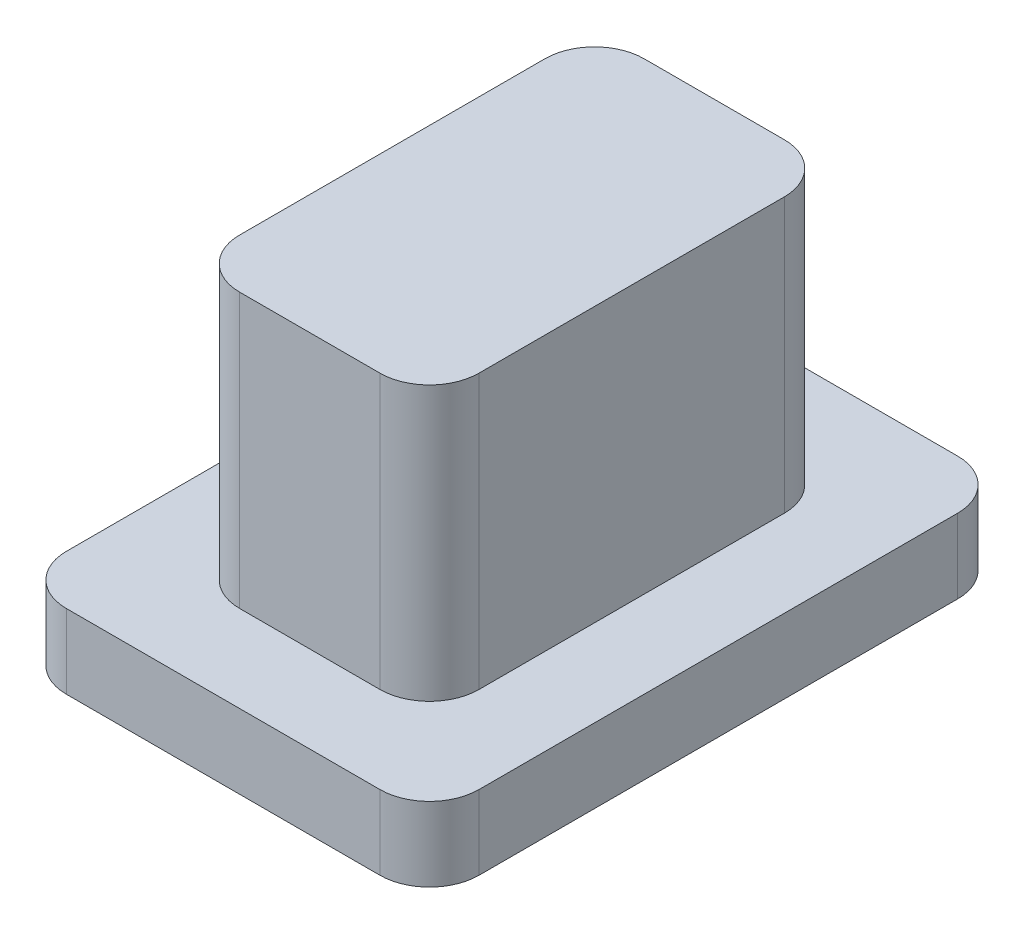
ISO-10303-21;
HEADER;
FILE_DESCRIPTION(('STEP AP214'),'2;1');
FILE_NAME('part.step','',(''),(''),'','','');
FILE_SCHEMA(('AUTOMOTIVE_DESIGN { 1 0 10303 214 1 1 1 1 }'));
ENDSEC;
DATA;
#1=APPLICATION_CONTEXT('core data for automotive mechanical design processes');
#2=APPLICATION_PROTOCOL_DEFINITION('international standard','automotive_design',2000,#1);
#3=PRODUCT_CONTEXT('',#1,'mechanical');
#4=PRODUCT('Part','Part','',(#3));
#5=PRODUCT_RELATED_PRODUCT_CATEGORY('part','',(#4));
#6=PRODUCT_DEFINITION_FORMATION('','',#4);
#7=PRODUCT_DEFINITION_CONTEXT('part definition',#1,'design');
#8=PRODUCT_DEFINITION('design','',#6,#7);
#9=PRODUCT_DEFINITION_SHAPE('','',#8);
#10=(LENGTH_UNIT() NAMED_UNIT(*) SI_UNIT(.MILLI.,.METRE.));
#11=(NAMED_UNIT(*) PLANE_ANGLE_UNIT() SI_UNIT($,.RADIAN.));
#12=(NAMED_UNIT(*) SI_UNIT($,.STERADIAN.) SOLID_ANGLE_UNIT());
#13=UNCERTAINTY_MEASURE_WITH_UNIT(LENGTH_MEASURE(1.E-05),#10,'distance_accuracy_value','');
#14=(GEOMETRIC_REPRESENTATION_CONTEXT(3) GLOBAL_UNCERTAINTY_ASSIGNED_CONTEXT((#13)) GLOBAL_UNIT_ASSIGNED_CONTEXT((#10,
#11,#12)) REPRESENTATION_CONTEXT('',''));
#15=CARTESIAN_POINT('',(0.,0.,0.));
#16=DIRECTION('',(0.,0.,1.));
#17=DIRECTION('',(1.,0.,0.));
#18=AXIS2_PLACEMENT_3D('',#15,#16,#17);
#19=CARTESIAN_POINT('',(2.5,0.9,-3.5));
#20=DIRECTION('',(-1.,0.,0.));
#21=DIRECTION('',(0.,0.,1.));
#22=AXIS2_PLACEMENT_3D('',#19,#20,#21);
#23=PLANE('',#22);
#24=DIRECTION('',(0.,0.,-1.));
#25=VECTOR('',#24,1.);
#26=CARTESIAN_POINT('',(2.5,0.,-3.5));
#27=LINE('',#26,#25);
#28=CARTESIAN_POINT('',(2.5,0.,2.9));
#29=VERTEX_POINT('',#28);
#30=CARTESIAN_POINT('',(2.5,0.,-2.9));
#31=VERTEX_POINT('',#30);
#32=EDGE_CURVE('E176',#29,#31,#27,.T.);
#33=ORIENTED_EDGE('',*,*,#32,.T.);
#34=DIRECTION('',(0.,-1.,0.));
#35=VECTOR('',#34,1.);
#36=CARTESIAN_POINT('',(2.5,0.9,-2.9));
#37=LINE('',#36,#35);
#38=CARTESIAN_POINT('',(2.5,0.9,-2.9));
#39=VERTEX_POINT('',#38);
#40=EDGE_CURVE('E154',#31,#39,#37,.F.);
#41=ORIENTED_EDGE('',*,*,#40,.T.);
#42=DIRECTION('',(0.,0.,-1.));
#43=VECTOR('',#42,1.);
#44=CARTESIAN_POINT('',(2.5,0.9,-3.5));
#45=LINE('',#44,#43);
#46=CARTESIAN_POINT('',(2.5,0.9,2.9));
#47=VERTEX_POINT('',#46);
#48=EDGE_CURVE('E187',#47,#39,#45,.T.);
#49=ORIENTED_EDGE('',*,*,#48,.F.);
#50=DIRECTION('',(0.,-1.,0.));
#51=VECTOR('',#50,1.);
#52=CARTESIAN_POINT('',(2.5,0.9,2.9));
#53=LINE('',#52,#51);
#54=EDGE_CURVE('E159',#47,#29,#53,.T.);
#55=ORIENTED_EDGE('',*,*,#54,.T.);
#56=EDGE_LOOP('',(#33,#41,#49,#55));
#57=FACE_BOUND('',#56,.T.);
#58=ADVANCED_FACE('F35',(#57),#23,.F.);
#59=CARTESIAN_POINT('',(-2.5,0.9,-3.5));
#60=DIRECTION('',(0.,0.,1.));
#61=DIRECTION('',(1.,0.,0.));
#62=AXIS2_PLACEMENT_3D('',#59,#60,#61);
#63=PLANE('',#62);
#64=DIRECTION('',(-1.,0.,0.));
#65=VECTOR('',#64,1.);
#66=CARTESIAN_POINT('',(-2.5,0.9,-3.5));
#67=LINE('',#66,#65);
#68=CARTESIAN_POINT('',(1.9,0.9,-3.5));
#69=VERTEX_POINT('',#68);
#70=CARTESIAN_POINT('',(-1.9,0.9,-3.5));
#71=VERTEX_POINT('',#70);
#72=EDGE_CURVE('E169',#69,#71,#67,.T.);
#73=ORIENTED_EDGE('',*,*,#72,.F.);
#74=DIRECTION('',(0.,-1.,0.));
#75=VECTOR('',#74,1.);
#76=CARTESIAN_POINT('',(1.9,0.9,-3.5));
#77=LINE('',#76,#75);
#78=CARTESIAN_POINT('',(1.9,0.,-3.5));
#79=VERTEX_POINT('',#78);
#80=EDGE_CURVE('E153',#69,#79,#77,.T.);
#81=ORIENTED_EDGE('',*,*,#80,.T.);
#82=DIRECTION('',(-1.,0.,0.));
#83=VECTOR('',#82,1.);
#84=CARTESIAN_POINT('',(-2.5,0.,-3.5));
#85=LINE('',#84,#83);
#86=CARTESIAN_POINT('',(-1.9,0.,-3.5));
#87=VERTEX_POINT('',#86);
#88=EDGE_CURVE('E166',#79,#87,#85,.T.);
#89=ORIENTED_EDGE('',*,*,#88,.T.);
#90=DIRECTION('',(0.,-1.,0.));
#91=VECTOR('',#90,1.);
#92=CARTESIAN_POINT('',(-1.9,0.9,-3.5));
#93=LINE('',#92,#91);
#94=EDGE_CURVE('E171',#87,#71,#93,.F.);
#95=ORIENTED_EDGE('',*,*,#94,.T.);
#96=EDGE_LOOP('',(#73,#81,#89,#95));
#97=FACE_BOUND('',#96,.T.);
#98=ADVANCED_FACE('F165',(#97),#63,.F.);
#99=CARTESIAN_POINT('',(-2.5,0.9,-3.5));
#100=DIRECTION('',(1.,0.,0.));
#101=DIRECTION('',(0.,0.,-1.));
#102=AXIS2_PLACEMENT_3D('',#99,#100,#101);
#103=PLANE('',#102);
#104=DIRECTION('',(0.,0.,1.));
#105=VECTOR('',#104,1.);
#106=CARTESIAN_POINT('',(-2.5,0.9,-3.5));
#107=LINE('',#106,#105);
#108=CARTESIAN_POINT('',(-2.5,0.9,-2.9));
#109=VERTEX_POINT('',#108);
#110=CARTESIAN_POINT('',(-2.5,0.9,2.9));
#111=VERTEX_POINT('',#110);
#112=EDGE_CURVE('E285',#109,#111,#107,.T.);
#113=ORIENTED_EDGE('',*,*,#112,.F.);
#114=DIRECTION('',(0.,-1.,0.));
#115=VECTOR('',#114,1.);
#116=CARTESIAN_POINT('',(-2.5,0.9,-2.9));
#117=LINE('',#116,#115);
#118=CARTESIAN_POINT('',(-2.5,0.,-2.9));
#119=VERTEX_POINT('',#118);
#120=EDGE_CURVE('E207',#109,#119,#117,.T.);
#121=ORIENTED_EDGE('',*,*,#120,.T.);
#122=DIRECTION('',(0.,0.,1.));
#123=VECTOR('',#122,1.);
#124=CARTESIAN_POINT('',(-2.5,0.,-3.5));
#125=LINE('',#124,#123);
#126=CARTESIAN_POINT('',(-2.5,0.,2.9));
#127=VERTEX_POINT('',#126);
#128=EDGE_CURVE('E175',#119,#127,#125,.T.);
#129=ORIENTED_EDGE('',*,*,#128,.T.);
#130=DIRECTION('',(0.,-1.,0.));
#131=VECTOR('',#130,1.);
#132=CARTESIAN_POINT('',(-2.5,0.9,2.9));
#133=LINE('',#132,#131);
#134=EDGE_CURVE('E205',#127,#111,#133,.F.);
#135=ORIENTED_EDGE('',*,*,#134,.T.);
#136=EDGE_LOOP('',(#113,#121,#129,#135));
#137=FACE_BOUND('',#136,.T.);
#138=ADVANCED_FACE('F306',(#137),#103,.F.);
#139=CARTESIAN_POINT('',(-2.5,0.9,3.5));
#140=DIRECTION('',(0.,0.,-1.));
#141=DIRECTION('',(-1.,0.,0.));
#142=AXIS2_PLACEMENT_3D('',#139,#140,#141);
#143=PLANE('',#142);
#144=DIRECTION('',(1.,0.,0.));
#145=VECTOR('',#144,1.);
#146=CARTESIAN_POINT('',(-2.5,0.,3.5));
#147=LINE('',#146,#145);
#148=CARTESIAN_POINT('',(-1.9,0.,3.5));
#149=VERTEX_POINT('',#148);
#150=CARTESIAN_POINT('',(1.9,0.,3.5));
#151=VERTEX_POINT('',#150);
#152=EDGE_CURVE('E179',#149,#151,#147,.T.);
#153=ORIENTED_EDGE('',*,*,#152,.T.);
#154=DIRECTION('',(0.,-1.,0.));
#155=VECTOR('',#154,1.);
#156=CARTESIAN_POINT('',(1.9,0.9,3.5));
#157=LINE('',#156,#155);
#158=CARTESIAN_POINT('',(1.9,0.9,3.5));
#159=VERTEX_POINT('',#158);
#160=EDGE_CURVE('E213',#151,#159,#157,.F.);
#161=ORIENTED_EDGE('',*,*,#160,.T.);
#162=DIRECTION('',(1.,0.,0.));
#163=VECTOR('',#162,1.);
#164=CARTESIAN_POINT('',(-2.5,0.9,3.5));
#165=LINE('',#164,#163);
#166=CARTESIAN_POINT('',(-1.9,0.9,3.5));
#167=VERTEX_POINT('',#166);
#168=EDGE_CURVE('E188',#167,#159,#165,.T.);
#169=ORIENTED_EDGE('',*,*,#168,.F.);
#170=DIRECTION('',(0.,-1.,0.));
#171=VECTOR('',#170,1.);
#172=CARTESIAN_POINT('',(-1.9,0.9,3.5));
#173=LINE('',#172,#171);
#174=EDGE_CURVE('E210',#167,#149,#173,.T.);
#175=ORIENTED_EDGE('',*,*,#174,.T.);
#176=EDGE_LOOP('',(#153,#161,#169,#175));
#177=FACE_BOUND('',#176,.T.);
#178=ADVANCED_FACE('F300',(#177),#143,.F.);
#179=CARTESIAN_POINT('',(0.,0.9,0.));
#180=DIRECTION('',(0.,1.,0.));
#181=DIRECTION('',(0.,0.,1.));
#182=AXIS2_PLACEMENT_3D('',#179,#180,#181);
#183=PLANE('',#182);
#184=DIRECTION('',(0.,0.,-1.));
#185=VECTOR('',#184,1.);
#186=CARTESIAN_POINT('',(1.45,0.9,-2.45));
#187=LINE('',#186,#185);
#188=CARTESIAN_POINT('',(1.45,0.9,1.85));
#189=VERTEX_POINT('',#188);
#190=CARTESIAN_POINT('',(1.45,0.9,-1.85));
#191=VERTEX_POINT('',#190);
#192=EDGE_CURVE('E251',#189,#191,#187,.T.);
#193=ORIENTED_EDGE('',*,*,#192,.F.);
#194=CARTESIAN_POINT('',(0.85,0.9,1.85));
#195=DIRECTION('',(0.,1.,0.));
#196=DIRECTION('',(0.,0.,1.));
#197=AXIS2_PLACEMENT_3D('',#194,#195,#196);
#198=CIRCLE('',#197,0.6);
#199=CARTESIAN_POINT('',(0.85,0.9,2.45));
#200=VERTEX_POINT('',#199);
#201=EDGE_CURVE('E43',#189,#200,#198,.F.);
#202=ORIENTED_EDGE('',*,*,#201,.T.);
#203=DIRECTION('',(1.,0.,0.));
#204=VECTOR('',#203,1.);
#205=CARTESIAN_POINT('',(-1.45,0.9,2.45));
#206=LINE('',#205,#204);
#207=CARTESIAN_POINT('',(-0.85,0.9,2.45));
#208=VERTEX_POINT('',#207);
#209=EDGE_CURVE('E249',#208,#200,#206,.T.);
#210=ORIENTED_EDGE('',*,*,#209,.F.);
#211=CARTESIAN_POINT('',(-0.85,0.9,1.85));
#212=DIRECTION('',(0.,1.,0.));
#213=DIRECTION('',(0.,0.,1.));
#214=AXIS2_PLACEMENT_3D('',#211,#212,#213);
#215=CIRCLE('',#214,0.6);
#216=CARTESIAN_POINT('',(-1.45,0.9,1.85));
#217=VERTEX_POINT('',#216);
#218=EDGE_CURVE('E11',#208,#217,#215,.F.);
#219=ORIENTED_EDGE('',*,*,#218,.T.);
#220=DIRECTION('',(0.,0.,1.));
#221=VECTOR('',#220,1.);
#222=CARTESIAN_POINT('',(-1.45,0.9,-2.45));
#223=LINE('',#222,#221);
#224=CARTESIAN_POINT('',(-1.45,0.9,-1.85));
#225=VERTEX_POINT('',#224);
#226=EDGE_CURVE('E257',#225,#217,#223,.T.);
#227=ORIENTED_EDGE('',*,*,#226,.F.);
#228=CARTESIAN_POINT('',(-0.85,0.9,-1.85));
#229=DIRECTION('',(0.,1.,0.));
#230=DIRECTION('',(0.,0.,1.));
#231=AXIS2_PLACEMENT_3D('',#228,#229,#230);
#232=CIRCLE('',#231,0.6);
#233=CARTESIAN_POINT('',(-0.85,0.9,-2.45));
#234=VERTEX_POINT('',#233);
#235=EDGE_CURVE('E241',#225,#234,#232,.F.);
#236=ORIENTED_EDGE('',*,*,#235,.T.);
#237=DIRECTION('',(-1.,0.,0.));
#238=VECTOR('',#237,1.);
#239=CARTESIAN_POINT('',(-1.45,0.9,-2.45));
#240=LINE('',#239,#238);
#241=CARTESIAN_POINT('',(0.849999999999999,0.9,-2.45));
#242=VERTEX_POINT('',#241);
#243=EDGE_CURVE('E277',#242,#234,#240,.T.);
#244=ORIENTED_EDGE('',*,*,#243,.F.);
#245=CARTESIAN_POINT('',(0.849999999999999,0.9,-1.85));
#246=DIRECTION('',(0.,1.,0.));
#247=DIRECTION('',(0.,0.,1.));
#248=AXIS2_PLACEMENT_3D('',#245,#246,#247);
#249=CIRCLE('',#248,0.6);
#250=EDGE_CURVE('E243',#242,#191,#249,.F.);
#251=ORIENTED_EDGE('',*,*,#250,.T.);
#252=EDGE_LOOP('',(#193,#202,#210,#219,#227,#236,#244,#251));
#253=FACE_BOUND('',#252,.T.);
#254=ORIENTED_EDGE('',*,*,#48,.T.);
#255=CARTESIAN_POINT('',(1.9,0.9,-2.9));
#256=DIRECTION('',(0.,1.,0.));
#257=DIRECTION('',(0.,0.,1.));
#258=AXIS2_PLACEMENT_3D('',#255,#256,#257);
#259=CIRCLE('',#258,0.6);
#260=EDGE_CURVE('E203',#39,#69,#259,.T.);
#261=ORIENTED_EDGE('',*,*,#260,.T.);
#262=ORIENTED_EDGE('',*,*,#72,.T.);
#263=CARTESIAN_POINT('',(-1.9,0.9,-2.9));
#264=DIRECTION('',(0.,1.,0.));
#265=DIRECTION('',(0.,0.,1.));
#266=AXIS2_PLACEMENT_3D('',#263,#264,#265);
#267=CIRCLE('',#266,0.6);
#268=EDGE_CURVE('E201',#71,#109,#267,.T.);
#269=ORIENTED_EDGE('',*,*,#268,.T.);
#270=ORIENTED_EDGE('',*,*,#112,.T.);
#271=CARTESIAN_POINT('',(-1.9,0.9,2.9));
#272=DIRECTION('',(0.,1.,0.));
#273=DIRECTION('',(0.,0.,1.));
#274=AXIS2_PLACEMENT_3D('',#271,#272,#273);
#275=CIRCLE('',#274,0.6);
#276=EDGE_CURVE('E197',#111,#167,#275,.T.);
#277=ORIENTED_EDGE('',*,*,#276,.T.);
#278=ORIENTED_EDGE('',*,*,#168,.T.);
#279=CARTESIAN_POINT('',(1.9,0.9,2.9));
#280=DIRECTION('',(0.,1.,0.));
#281=DIRECTION('',(0.,0.,1.));
#282=AXIS2_PLACEMENT_3D('',#279,#280,#281);
#283=CIRCLE('',#282,0.6);
#284=EDGE_CURVE('E199',#159,#47,#283,.T.);
#285=ORIENTED_EDGE('',*,*,#284,.T.);
#286=EDGE_LOOP('',(#254,#261,#262,#269,#270,#277,#278,#285));
#287=FACE_BOUND('',#286,.T.);
#288=ADVANCED_FACE('F247',(#253,#287),#183,.T.);
#289=CARTESIAN_POINT('',(0.,0.,0.));
#290=DIRECTION('',(0.,1.,0.));
#291=DIRECTION('',(0.,0.,1.));
#292=AXIS2_PLACEMENT_3D('',#289,#290,#291);
#293=PLANE('',#292);
#294=ORIENTED_EDGE('',*,*,#88,.F.);
#295=CARTESIAN_POINT('',(1.9,0.,-2.9));
#296=DIRECTION('',(0.,1.,0.));
#297=DIRECTION('',(0.,0.,1.));
#298=AXIS2_PLACEMENT_3D('',#295,#296,#297);
#299=CIRCLE('',#298,0.6);
#300=EDGE_CURVE('E149',#79,#31,#299,.F.);
#301=ORIENTED_EDGE('',*,*,#300,.T.);
#302=ORIENTED_EDGE('',*,*,#32,.F.);
#303=CARTESIAN_POINT('',(1.9,0.,2.9));
#304=DIRECTION('',(0.,1.,0.));
#305=DIRECTION('',(0.,0.,1.));
#306=AXIS2_PLACEMENT_3D('',#303,#304,#305);
#307=CIRCLE('',#306,0.6);
#308=EDGE_CURVE('E191',#29,#151,#307,.F.);
#309=ORIENTED_EDGE('',*,*,#308,.T.);
#310=ORIENTED_EDGE('',*,*,#152,.F.);
#311=CARTESIAN_POINT('',(-1.9,0.,2.9));
#312=DIRECTION('',(0.,1.,0.));
#313=DIRECTION('',(0.,0.,1.));
#314=AXIS2_PLACEMENT_3D('',#311,#312,#313);
#315=CIRCLE('',#314,0.6);
#316=EDGE_CURVE('E170',#149,#127,#315,.F.);
#317=ORIENTED_EDGE('',*,*,#316,.T.);
#318=ORIENTED_EDGE('',*,*,#128,.F.);
#319=CARTESIAN_POINT('',(-1.9,0.,-2.9));
#320=DIRECTION('',(0.,1.,0.));
#321=DIRECTION('',(0.,0.,1.));
#322=AXIS2_PLACEMENT_3D('',#319,#320,#321);
#323=CIRCLE('',#322,0.6);
#324=EDGE_CURVE('E160',#119,#87,#323,.F.);
#325=ORIENTED_EDGE('',*,*,#324,.T.);
#326=EDGE_LOOP('',(#294,#301,#302,#309,#310,#317,#318,#325));
#327=FACE_BOUND('',#326,.T.);
#328=ADVANCED_FACE('F173',(#327),#293,.F.);
#329=CARTESIAN_POINT('',(1.45,4.22,-2.45));
#330=DIRECTION('',(-1.,0.,0.));
#331=DIRECTION('',(0.,0.,1.));
#332=AXIS2_PLACEMENT_3D('',#329,#330,#331);
#333=PLANE('',#332);
#334=ORIENTED_EDGE('',*,*,#192,.T.);
#335=DIRECTION('',(0.,-1.,0.));
#336=VECTOR('',#335,1.);
#337=CARTESIAN_POINT('',(1.45,4.22,-1.85));
#338=LINE('',#337,#336);
#339=CARTESIAN_POINT('',(1.45,4.22,-1.85));
#340=VERTEX_POINT('',#339);
#341=EDGE_CURVE('E235',#191,#340,#338,.F.);
#342=ORIENTED_EDGE('',*,*,#341,.T.);
#343=DIRECTION('',(0.,0.,-1.));
#344=VECTOR('',#343,1.);
#345=CARTESIAN_POINT('',(1.45,4.22,-2.45));
#346=LINE('',#345,#344);
#347=CARTESIAN_POINT('',(1.45,4.22,1.85));
#348=VERTEX_POINT('',#347);
#349=EDGE_CURVE('E256',#348,#340,#346,.T.);
#350=ORIENTED_EDGE('',*,*,#349,.F.);
#351=DIRECTION('',(0.,-1.,0.));
#352=VECTOR('',#351,1.);
#353=CARTESIAN_POINT('',(1.45,4.22,1.85));
#354=LINE('',#353,#352);
#355=EDGE_CURVE('E232',#348,#189,#354,.T.);
#356=ORIENTED_EDGE('',*,*,#355,.T.);
#357=EDGE_LOOP('',(#334,#342,#350,#356));
#358=FACE_BOUND('',#357,.T.);
#359=ADVANCED_FACE('F267',(#358),#333,.F.);
#360=CARTESIAN_POINT('',(-1.45,4.22,-2.45));
#361=DIRECTION('',(0.,0.,1.));
#362=DIRECTION('',(1.,0.,0.));
#363=AXIS2_PLACEMENT_3D('',#360,#361,#362);
#364=PLANE('',#363);
#365=ORIENTED_EDGE('',*,*,#243,.T.);
#366=DIRECTION('',(0.,-1.,0.));
#367=VECTOR('',#366,1.);
#368=CARTESIAN_POINT('',(-0.85,4.22,-2.45));
#369=LINE('',#368,#367);
#370=CARTESIAN_POINT('',(-0.85,4.22,-2.45));
#371=VERTEX_POINT('',#370);
#372=EDGE_CURVE('E223',#234,#371,#369,.F.);
#373=ORIENTED_EDGE('',*,*,#372,.T.);
#374=DIRECTION('',(-1.,0.,0.));
#375=VECTOR('',#374,1.);
#376=CARTESIAN_POINT('',(-1.45,4.22,-2.45));
#377=LINE('',#376,#375);
#378=CARTESIAN_POINT('',(0.849999999999999,4.22,-2.45));
#379=VERTEX_POINT('',#378);
#380=EDGE_CURVE('E269',#379,#371,#377,.T.);
#381=ORIENTED_EDGE('',*,*,#380,.F.);
#382=DIRECTION('',(0.,-1.,0.));
#383=VECTOR('',#382,1.);
#384=CARTESIAN_POINT('',(0.849999999999999,4.22,-2.45));
#385=LINE('',#384,#383);
#386=EDGE_CURVE('E220',#379,#242,#385,.T.);
#387=ORIENTED_EDGE('',*,*,#386,.T.);
#388=EDGE_LOOP('',(#365,#373,#381,#387));
#389=FACE_BOUND('',#388,.T.);
#390=ADVANCED_FACE('F336',(#389),#364,.F.);
#391=CARTESIAN_POINT('',(-1.45,4.22,-2.45));
#392=DIRECTION('',(1.,0.,0.));
#393=DIRECTION('',(0.,0.,-1.));
#394=AXIS2_PLACEMENT_3D('',#391,#392,#393);
#395=PLANE('',#394);
#396=DIRECTION('',(0.,0.,1.));
#397=VECTOR('',#396,1.);
#398=CARTESIAN_POINT('',(-1.45,4.22,-2.45));
#399=LINE('',#398,#397);
#400=CARTESIAN_POINT('',(-1.45,4.22,-1.85));
#401=VERTEX_POINT('',#400);
#402=CARTESIAN_POINT('',(-1.45,4.22,1.85));
#403=VERTEX_POINT('',#402);
#404=EDGE_CURVE('E271',#401,#403,#399,.T.);
#405=ORIENTED_EDGE('',*,*,#404,.F.);
#406=DIRECTION('',(0.,-1.,0.));
#407=VECTOR('',#406,1.);
#408=CARTESIAN_POINT('',(-1.45,4.22,-1.85));
#409=LINE('',#408,#407);
#410=EDGE_CURVE('E217',#401,#225,#409,.T.);
#411=ORIENTED_EDGE('',*,*,#410,.T.);
#412=ORIENTED_EDGE('',*,*,#226,.T.);
#413=DIRECTION('',(0.,-1.,0.));
#414=VECTOR('',#413,1.);
#415=CARTESIAN_POINT('',(-1.45,4.22,1.85));
#416=LINE('',#415,#414);
#417=EDGE_CURVE('E215',#217,#403,#416,.F.);
#418=ORIENTED_EDGE('',*,*,#417,.T.);
#419=EDGE_LOOP('',(#405,#411,#412,#418));
#420=FACE_BOUND('',#419,.T.);
#421=ADVANCED_FACE('F339',(#420),#395,.F.);
#422=CARTESIAN_POINT('',(-1.45,4.22,2.45));
#423=DIRECTION('',(0.,0.,-1.));
#424=DIRECTION('',(-1.,0.,0.));
#425=AXIS2_PLACEMENT_3D('',#422,#423,#424);
#426=PLANE('',#425);
#427=ORIENTED_EDGE('',*,*,#209,.T.);
#428=DIRECTION('',(0.,-1.,0.));
#429=VECTOR('',#428,1.);
#430=CARTESIAN_POINT('',(0.85,4.22,2.45));
#431=LINE('',#430,#429);
#432=CARTESIAN_POINT('',(0.85,4.22,2.45));
#433=VERTEX_POINT('',#432);
#434=EDGE_CURVE('E50',#200,#433,#431,.F.);
#435=ORIENTED_EDGE('',*,*,#434,.T.);
#436=DIRECTION('',(1.,0.,0.));
#437=VECTOR('',#436,1.);
#438=CARTESIAN_POINT('',(-1.45,4.22,2.45));
#439=LINE('',#438,#437);
#440=CARTESIAN_POINT('',(-0.85,4.22,2.45));
#441=VERTEX_POINT('',#440);
#442=EDGE_CURVE('E181',#441,#433,#439,.T.);
#443=ORIENTED_EDGE('',*,*,#442,.F.);
#444=DIRECTION('',(0.,-1.,0.));
#445=VECTOR('',#444,1.);
#446=CARTESIAN_POINT('',(-0.85,4.22,2.45));
#447=LINE('',#446,#445);
#448=EDGE_CURVE('E237',#441,#208,#447,.T.);
#449=ORIENTED_EDGE('',*,*,#448,.T.);
#450=EDGE_LOOP('',(#427,#435,#443,#449));
#451=FACE_BOUND('',#450,.T.);
#452=ADVANCED_FACE('F254',(#451),#426,.F.);
#453=CARTESIAN_POINT('',(0.,4.22,0.));
#454=DIRECTION('',(0.,1.,0.));
#455=DIRECTION('',(0.,0.,1.));
#456=AXIS2_PLACEMENT_3D('',#453,#454,#455);
#457=PLANE('',#456);
#458=ORIENTED_EDGE('',*,*,#380,.T.);
#459=CARTESIAN_POINT('',(-0.85,4.22,-1.85));
#460=DIRECTION('',(0.,1.,0.));
#461=DIRECTION('',(0.,0.,1.));
#462=AXIS2_PLACEMENT_3D('',#459,#460,#461);
#463=CIRCLE('',#462,0.6);
#464=EDGE_CURVE('E230',#371,#401,#463,.T.);
#465=ORIENTED_EDGE('',*,*,#464,.T.);
#466=ORIENTED_EDGE('',*,*,#404,.T.);
#467=CARTESIAN_POINT('',(-0.85,4.22,1.85));
#468=DIRECTION('',(0.,1.,0.));
#469=DIRECTION('',(0.,0.,1.));
#470=AXIS2_PLACEMENT_3D('',#467,#468,#469);
#471=CIRCLE('',#470,0.6);
#472=EDGE_CURVE('E57',#403,#441,#471,.T.);
#473=ORIENTED_EDGE('',*,*,#472,.T.);
#474=ORIENTED_EDGE('',*,*,#442,.T.);
#475=CARTESIAN_POINT('',(0.85,4.22,1.85));
#476=DIRECTION('',(0.,1.,0.));
#477=DIRECTION('',(0.,0.,1.));
#478=AXIS2_PLACEMENT_3D('',#475,#476,#477);
#479=CIRCLE('',#478,0.6);
#480=EDGE_CURVE('E226',#433,#348,#479,.T.);
#481=ORIENTED_EDGE('',*,*,#480,.T.);
#482=ORIENTED_EDGE('',*,*,#349,.T.);
#483=CARTESIAN_POINT('',(0.849999999999999,4.22,-1.85));
#484=DIRECTION('',(0.,1.,0.));
#485=DIRECTION('',(0.,0.,1.));
#486=AXIS2_PLACEMENT_3D('',#483,#484,#485);
#487=CIRCLE('',#486,0.6);
#488=EDGE_CURVE('E228',#340,#379,#487,.T.);
#489=ORIENTED_EDGE('',*,*,#488,.T.);
#490=EDGE_LOOP('',(#458,#465,#466,#473,#474,#481,#482,#489));
#491=FACE_BOUND('',#490,.T.);
#492=ADVANCED_FACE('F264',(#491),#457,.T.);
#493=CARTESIAN_POINT('',(1.9,0.9,-2.9));
#494=DIRECTION('',(0.,-1.,0.));
#495=DIRECTION('',(0.,0.,-1.));
#496=AXIS2_PLACEMENT_3D('',#493,#494,#495);
#497=CYLINDRICAL_SURFACE('',#496,0.6);
#498=ORIENTED_EDGE('',*,*,#260,.F.);
#499=ORIENTED_EDGE('',*,*,#40,.F.);
#500=ORIENTED_EDGE('',*,*,#300,.F.);
#501=ORIENTED_EDGE('',*,*,#80,.F.);
#502=EDGE_LOOP('',(#498,#499,#500,#501));
#503=FACE_BOUND('',#502,.T.);
#504=ADVANCED_FACE('F152',(#503),#497,.T.);
#505=CARTESIAN_POINT('',(-1.9,0.9,-2.9));
#506=DIRECTION('',(0.,-1.,0.));
#507=DIRECTION('',(0.,0.,-1.));
#508=AXIS2_PLACEMENT_3D('',#505,#506,#507);
#509=CYLINDRICAL_SURFACE('',#508,0.6);
#510=ORIENTED_EDGE('',*,*,#268,.F.);
#511=ORIENTED_EDGE('',*,*,#94,.F.);
#512=ORIENTED_EDGE('',*,*,#324,.F.);
#513=ORIENTED_EDGE('',*,*,#120,.F.);
#514=EDGE_LOOP('',(#510,#511,#512,#513));
#515=FACE_BOUND('',#514,.T.);
#516=ADVANCED_FACE('F310',(#515),#509,.T.);
#517=CARTESIAN_POINT('',(1.9,0.9,2.9));
#518=DIRECTION('',(0.,-1.,0.));
#519=DIRECTION('',(0.,0.,-1.));
#520=AXIS2_PLACEMENT_3D('',#517,#518,#519);
#521=CYLINDRICAL_SURFACE('',#520,0.6);
#522=ORIENTED_EDGE('',*,*,#284,.F.);
#523=ORIENTED_EDGE('',*,*,#160,.F.);
#524=ORIENTED_EDGE('',*,*,#308,.F.);
#525=ORIENTED_EDGE('',*,*,#54,.F.);
#526=EDGE_LOOP('',(#522,#523,#524,#525));
#527=FACE_BOUND('',#526,.T.);
#528=ADVANCED_FACE('F297',(#527),#521,.T.);
#529=CARTESIAN_POINT('',(-1.9,0.9,2.9));
#530=DIRECTION('',(0.,-1.,0.));
#531=DIRECTION('',(0.,0.,-1.));
#532=AXIS2_PLACEMENT_3D('',#529,#530,#531);
#533=CYLINDRICAL_SURFACE('',#532,0.6);
#534=ORIENTED_EDGE('',*,*,#276,.F.);
#535=ORIENTED_EDGE('',*,*,#134,.F.);
#536=ORIENTED_EDGE('',*,*,#316,.F.);
#537=ORIENTED_EDGE('',*,*,#174,.F.);
#538=EDGE_LOOP('',(#534,#535,#536,#537));
#539=FACE_BOUND('',#538,.T.);
#540=ADVANCED_FACE('F302',(#539),#533,.T.);
#541=CARTESIAN_POINT('',(-0.85,4.22,-1.85));
#542=DIRECTION('',(0.,-1.,0.));
#543=DIRECTION('',(0.,0.,-1.));
#544=AXIS2_PLACEMENT_3D('',#541,#542,#543);
#545=CYLINDRICAL_SURFACE('',#544,0.6);
#546=ORIENTED_EDGE('',*,*,#464,.F.);
#547=ORIENTED_EDGE('',*,*,#372,.F.);
#548=ORIENTED_EDGE('',*,*,#235,.F.);
#549=ORIENTED_EDGE('',*,*,#410,.F.);
#550=EDGE_LOOP('',(#546,#547,#548,#549));
#551=FACE_BOUND('',#550,.T.);
#552=ADVANCED_FACE('F374',(#551),#545,.T.);
#553=CARTESIAN_POINT('',(0.849999999999999,4.22,-1.85));
#554=DIRECTION('',(0.,-1.,0.));
#555=DIRECTION('',(0.,0.,-1.));
#556=AXIS2_PLACEMENT_3D('',#553,#554,#555);
#557=CYLINDRICAL_SURFACE('',#556,0.6);
#558=ORIENTED_EDGE('',*,*,#488,.F.);
#559=ORIENTED_EDGE('',*,*,#341,.F.);
#560=ORIENTED_EDGE('',*,*,#250,.F.);
#561=ORIENTED_EDGE('',*,*,#386,.F.);
#562=EDGE_LOOP('',(#558,#559,#560,#561));
#563=FACE_BOUND('',#562,.T.);
#564=ADVANCED_FACE('F383',(#563),#557,.T.);
#565=CARTESIAN_POINT('',(0.85,4.22,1.85));
#566=DIRECTION('',(0.,-1.,0.));
#567=DIRECTION('',(0.,0.,-1.));
#568=AXIS2_PLACEMENT_3D('',#565,#566,#567);
#569=CYLINDRICAL_SURFACE('',#568,0.6);
#570=ORIENTED_EDGE('',*,*,#480,.F.);
#571=ORIENTED_EDGE('',*,*,#434,.F.);
#572=ORIENTED_EDGE('',*,*,#201,.F.);
#573=ORIENTED_EDGE('',*,*,#355,.F.);
#574=EDGE_LOOP('',(#570,#571,#572,#573));
#575=FACE_BOUND('',#574,.T.);
#576=ADVANCED_FACE('F260',(#575),#569,.T.);
#577=CARTESIAN_POINT('',(-0.85,4.22,1.85));
#578=DIRECTION('',(0.,-1.,0.));
#579=DIRECTION('',(0.,0.,-1.));
#580=AXIS2_PLACEMENT_3D('',#577,#578,#579);
#581=CYLINDRICAL_SURFACE('',#580,0.6);
#582=ORIENTED_EDGE('',*,*,#472,.F.);
#583=ORIENTED_EDGE('',*,*,#417,.F.);
#584=ORIENTED_EDGE('',*,*,#218,.F.);
#585=ORIENTED_EDGE('',*,*,#448,.F.);
#586=EDGE_LOOP('',(#582,#583,#584,#585));
#587=FACE_BOUND('',#586,.T.);
#588=ADVANCED_FACE('F37',(#587),#581,.T.);
#589=CLOSED_SHELL('',(#58,#98,#138,#178,#288,#328,#359,#390,#421,#452,#492,#504,#516,#528,#540,
#552,#564,#576,#588));
#590=MANIFOLD_SOLID_BREP('B2',#589);
#591=ADVANCED_BREP_SHAPE_REPRESENTATION('',(#18,#590),#14);
#592=SHAPE_DEFINITION_REPRESENTATION(#9,#591);
ENDSEC;
END-ISO-10303-21;
